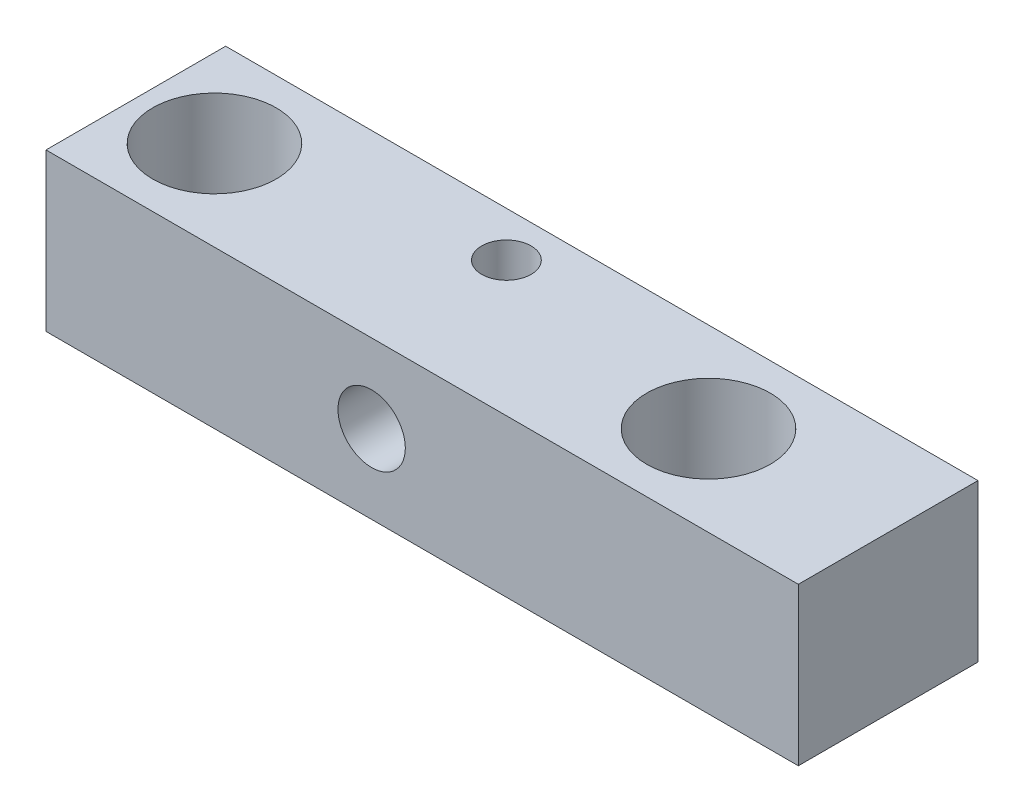
ISO-10303-21;
HEADER;
FILE_DESCRIPTION(('STEP AP214'),'2;1');
FILE_NAME('part.step','',(''),(''),'','','');
FILE_SCHEMA(('AUTOMOTIVE_DESIGN { 1 0 10303 214 1 1 1 1 }'));
ENDSEC;
DATA;
#1=APPLICATION_CONTEXT('core data for automotive mechanical design processes');
#2=APPLICATION_PROTOCOL_DEFINITION('international standard','automotive_design',2000,#1);
#3=PRODUCT_CONTEXT('',#1,'mechanical');
#4=PRODUCT('Part','Part','',(#3));
#5=PRODUCT_RELATED_PRODUCT_CATEGORY('part','',(#4));
#6=PRODUCT_DEFINITION_FORMATION('','',#4);
#7=PRODUCT_DEFINITION_CONTEXT('part definition',#1,'design');
#8=PRODUCT_DEFINITION('design','',#6,#7);
#9=PRODUCT_DEFINITION_SHAPE('','',#8);
#10=(LENGTH_UNIT() NAMED_UNIT(*) SI_UNIT(.MILLI.,.METRE.));
#11=(NAMED_UNIT(*) PLANE_ANGLE_UNIT() SI_UNIT($,.RADIAN.));
#12=(NAMED_UNIT(*) SI_UNIT($,.STERADIAN.) SOLID_ANGLE_UNIT());
#13=UNCERTAINTY_MEASURE_WITH_UNIT(LENGTH_MEASURE(1.E-05),#10,'distance_accuracy_value','');
#14=(GEOMETRIC_REPRESENTATION_CONTEXT(3) GLOBAL_UNCERTAINTY_ASSIGNED_CONTEXT((#13)) GLOBAL_UNIT_ASSIGNED_CONTEXT((#10,
#11,#12)) REPRESENTATION_CONTEXT('',''));
#15=CARTESIAN_POINT('',(0.,0.,0.));
#16=DIRECTION('',(0.,0.,1.));
#17=DIRECTION('',(1.,0.,0.));
#18=AXIS2_PLACEMENT_3D('',#15,#16,#17);
#19=CARTESIAN_POINT('',(5.40284360189574,7.,-6.23933649289099));
#20=DIRECTION('',(0.,-1.,0.));
#21=DIRECTION('',(0.,0.,-1.));
#22=AXIS2_PLACEMENT_3D('',#19,#20,#21);
#23=CYLINDRICAL_SURFACE('',#22,1.1);
#24=CARTESIAN_POINT('',(5.40284360189574,7.,-6.23933649289099));
#25=DIRECTION('',(0.,1.,0.));
#26=DIRECTION('',(0.,0.,1.));
#27=AXIS2_PLACEMENT_3D('',#24,#25,#26);
#28=CIRCLE('',#27,1.1);
#29=CARTESIAN_POINT('',(5.40284360189574,7.,-5.13933649289099));
#30=VERTEX_POINT('',#29);
#31=EDGE_CURVE('E156',#30,#30,#28,.T.);
#32=ORIENTED_EDGE('',*,*,#31,.T.);
#33=EDGE_LOOP('',(#32));
#34=FACE_BOUND('',#33,.T.);
#35=CARTESIAN_POINT('',(5.40284360189574,0.,-6.23933649289099));
#36=DIRECTION('',(0.,1.,0.));
#37=DIRECTION('',(0.,0.,1.));
#38=AXIS2_PLACEMENT_3D('',#35,#36,#37);
#39=CIRCLE('',#38,1.1);
#40=CARTESIAN_POINT('',(5.40284360189574,0.,-5.13933649289099));
#41=VERTEX_POINT('',#40);
#42=EDGE_CURVE('E159',#41,#41,#39,.T.);
#43=ORIENTED_EDGE('',*,*,#42,.F.);
#44=EDGE_LOOP('',(#43));
#45=FACE_BOUND('',#44,.T.);
#46=CARTESIAN_POINT('',(4.30284360189574,4.51980390271856,-6.23933649289099));
#47=CARTESIAN_POINT('',(4.30283809735259,4.5197884223303,-6.21316856956749));
#48=CARTESIAN_POINT('',(4.30377782484599,4.52081207124238,-6.18702303009781));
#49=CARTESIAN_POINT('',(4.30748931555892,4.52479800111967,-6.13505941542424));
#50=CARTESIAN_POINT('',(4.3102576054167,4.52775660652193,-6.10924081377893));
#51=CARTESIAN_POINT('',(4.32112883332008,4.53923247610127,-6.03321089474059));
#52=CARTESIAN_POINT('',(4.33180150244313,4.55035709449521,-5.98373727546318));
#53=CARTESIAN_POINT('',(4.3591400995259,4.57751770428368,-5.88842851211875));
#54=CARTESIAN_POINT('',(4.37576399731924,4.59351913853104,-5.84257053691945));
#55=CARTESIAN_POINT('',(4.41439582734661,4.62856308385542,-5.75425812845338));
#56=CARTESIAN_POINT('',(4.4364226815754,4.64761619920093,-5.71181636855708));
#57=CARTESIAN_POINT('',(4.49019641565153,4.6910030847283,-5.62265827431824));
#58=CARTESIAN_POINT('',(4.52300173276228,4.7156409215698,-5.57672888670937));
#59=CARTESIAN_POINT('',(4.59526376507523,4.76480419804651,-5.49034642774148));
#60=CARTESIAN_POINT('',(4.63472418844916,4.78932956714665,-5.44989643223869));
#61=CARTESIAN_POINT('',(4.72824209288039,4.84100178731811,-5.36785080272779));
#62=CARTESIAN_POINT('',(4.78364788634491,4.86775229130149,-5.327516968547));
#63=CARTESIAN_POINT('',(4.90279476349158,4.91564342800206,-5.25714130230387));
#64=CARTESIAN_POINT('',(4.96651818716249,4.93679566672785,-5.22707813940476));
#65=CARTESIAN_POINT('',(5.08098224458686,4.9658839728927,-5.18626786245236));
#66=CARTESIAN_POINT('',(5.130113554023,4.97587441789688,-5.17244622932842));
#67=CARTESIAN_POINT('',(5.23053681769804,4.99093232203229,-5.15171005200273));
#68=CARTESIAN_POINT('',(5.28182686417869,4.99600403652587,-5.14478953726044));
#69=CARTESIAN_POINT('',(5.38524720386177,5.00079198832914,-5.13825451482477));
#70=CARTESIAN_POINT('',(5.43737920242274,5.00049548606265,-5.13865738662515));
#71=CARTESIAN_POINT('',(5.54076123178974,4.99454372638376,-5.14678513158139));
#72=CARTESIAN_POINT('',(5.59201103744999,4.98888712106594,-5.15451184646464));
#73=CARTESIAN_POINT('',(5.69064156686115,4.97295456066322,-5.17648652723492));
#74=CARTESIAN_POINT('',(5.73809250008411,4.96282394908727,-5.19052954630851));
#75=CARTESIAN_POINT('',(5.82982347806251,4.93872861751305,-5.22440719259422));
#76=CARTESIAN_POINT('',(5.87410284623278,4.92476308246969,-5.24424305102879));
#77=CARTESIAN_POINT('',(5.96353842120922,4.89216706769043,-5.29146856015379));
#78=CARTESIAN_POINT('',(6.0082548079982,4.87319233870793,-5.31944929100812));
#79=CARTESIAN_POINT('',(6.09257955832138,4.83283682505479,-5.38085538797724));
#80=CARTESIAN_POINT('',(6.13218335865204,4.81145392241955,-5.41428555856268));
#81=CARTESIAN_POINT('',(6.21309335628508,4.76337237589801,-5.49283972951178));
#82=CARTESIAN_POINT('',(6.25327718094774,4.73643907867924,-5.5389774640203));
#83=CARTESIAN_POINT('',(6.32570340731536,4.68336061709581,-5.63760851415351));
#84=CARTESIAN_POINT('',(6.35794065407717,4.65721597392981,-5.69010592254221));
#85=CARTESIAN_POINT('',(6.40781667071336,4.6139477123103,-5.7894177560883));
#86=CARTESIAN_POINT('',(6.42710127666119,4.5960863068379,-5.8350805435138));
#87=CARTESIAN_POINT('',(6.45957834340442,4.56480947024316,-5.92982029013945));
#88=CARTESIAN_POINT('',(6.47279824586455,4.55137409164936,-5.97888069076255));
#89=CARTESIAN_POINT('',(6.48921958421055,4.53435203403151,-6.06330748652717));
#90=CARTESIAN_POINT('',(6.49427985583401,4.52898427735783,-6.09795274438175));
#91=CARTESIAN_POINT('',(6.50111397735627,4.52167041089261,-6.16815235281215));
#92=CARTESIAN_POINT('',(6.50286538638044,4.51974766987578,-6.20371126478535));
#93=CARTESIAN_POINT('',(6.50284360189574,4.51980390271856,-6.23933649289099));
#94=B_SPLINE_CURVE_WITH_KNOTS('',3,(#46,#47,#48,#49,#50,#51,#52,#53,#54,#55,#56,#57,#58,#59,#60,
#61,#62,#63,#64,#65,#66,#67,#68,#69,#70,#71,#72,#73,#74,#75,#76,#77,#78,#79,#80,#81,#82,#83,#84,
#85,#86,#87,#88,#89,#90,#91,#92,#93),.UNSPECIFIED.,.F.,.F.,(4,2,2,2,2,2,2,2,2,2,2,2,2,2,2,2,2,2,
2,2,2,2,2,4),(0.,0.0784271539245262,0.156705761903694,0.311235939811898,0.464695617922897,
0.618700607549997,0.802819713980823,0.98704175109855,1.20651401122566,1.42552764512265,
1.58088877497421,1.73611537637143,1.89171040174665,2.04734456499831,2.19825724424889,
2.34920202217558,2.5167590995247,2.6844647097342,2.8842363485675,3.08413724018056,
3.24169550381706,3.39853363780779,3.50448843352519,3.61115927589421),.UNSPECIFIED.);
#95=CARTESIAN_POINT('',(4.30284360189574,4.51980390271856,-6.23933649289099));
#96=VERTEX_POINT('',#95);
#97=CARTESIAN_POINT('',(6.50284360189574,4.51980390271856,-6.23933649289099));
#98=VERTEX_POINT('',#97);
#99=EDGE_CURVE('E55',#96,#98,#94,.T.);
#100=ORIENTED_EDGE('',*,*,#99,.F.);
#101=DIRECTION('',(0.,-1.,0.));
#102=VECTOR('',#101,1.);
#103=CARTESIAN_POINT('',(4.30284360189574,7.,-6.23933649289099));
#104=LINE('',#103,#102);
#105=CARTESIAN_POINT('',(4.30284360189574,2.48019609728144,-6.23933649289099));
#106=VERTEX_POINT('',#105);
#107=EDGE_CURVE('E13',#96,#106,#104,.T.);
#108=ORIENTED_EDGE('',*,*,#107,.T.);
#109=CARTESIAN_POINT('',(6.50284360189574,2.48019609728144,-6.23933649289099));
#110=CARTESIAN_POINT('',(6.5028491064389,2.4802115776697,-6.21316856956749));
#111=CARTESIAN_POINT('',(6.50190937894549,2.47918792875762,-6.18702303009781));
#112=CARTESIAN_POINT('',(6.49819788823257,2.47520199888033,-6.13505941542424));
#113=CARTESIAN_POINT('',(6.49542959837479,2.47224339347807,-6.10924081377893));
#114=CARTESIAN_POINT('',(6.48455837047141,2.46076752389873,-6.03321089474059));
#115=CARTESIAN_POINT('',(6.47388570134835,2.44964290550479,-5.98373727546318));
#116=CARTESIAN_POINT('',(6.44654710426558,2.42248229571632,-5.88842851211875));
#117=CARTESIAN_POINT('',(6.42992320647224,2.40648086146896,-5.84257053691945));
#118=CARTESIAN_POINT('',(6.39129137644488,2.37143691614458,-5.75425812845338));
#119=CARTESIAN_POINT('',(6.36926452221609,2.35238380079907,-5.71181636855708));
#120=CARTESIAN_POINT('',(6.31549078813995,2.3089969152717,-5.62265827431824));
#121=CARTESIAN_POINT('',(6.2826854710292,2.2843590784302,-5.57672888670937));
#122=CARTESIAN_POINT('',(6.21042343871625,2.23519580195349,-5.49034642774148));
#123=CARTESIAN_POINT('',(6.17096301534232,2.21067043285335,-5.44989643223869));
#124=CARTESIAN_POINT('',(6.0774451109111,2.15899821268189,-5.36785080272779));
#125=CARTESIAN_POINT('',(6.02203931744658,2.13224770869851,-5.327516968547));
#126=CARTESIAN_POINT('',(5.90289244029991,2.08435657199794,-5.25714130230387));
#127=CARTESIAN_POINT('',(5.839169016629,2.06320433327215,-5.22707813940476));
#128=CARTESIAN_POINT('',(5.72470495920463,2.0341160271073,-5.18626786245236));
#129=CARTESIAN_POINT('',(5.67557364976849,2.02412558210312,-5.17244622932842));
#130=CARTESIAN_POINT('',(5.57515038609345,2.00906767796771,-5.15171005200273));
#131=CARTESIAN_POINT('',(5.5238603396128,2.00399596347413,-5.14478953726044));
#132=CARTESIAN_POINT('',(5.42043999992972,1.99920801167086,-5.13825451482477));
#133=CARTESIAN_POINT('',(5.36830800136875,1.99950451393735,-5.13865738662515));
#134=CARTESIAN_POINT('',(5.26492597200174,2.00545627361624,-5.14678513158139));
#135=CARTESIAN_POINT('',(5.21367616634149,2.01111287893406,-5.15451184646464));
#136=CARTESIAN_POINT('',(5.11504563693033,2.02704543933678,-5.17648652723492));
#137=CARTESIAN_POINT('',(5.06759470370738,2.03717605091273,-5.19052954630851));
#138=CARTESIAN_POINT('',(4.97586372572898,2.06127138248694,-5.22440719259422));
#139=CARTESIAN_POINT('',(4.93158435755871,2.07523691753031,-5.24424305102879));
#140=CARTESIAN_POINT('',(4.84214878258226,2.10783293230957,-5.29146856015378));
#141=CARTESIAN_POINT('',(4.79743239579329,2.12680766129207,-5.31944929100812));
#142=CARTESIAN_POINT('',(4.7131076454701,2.16716317494521,-5.38085538797723));
#143=CARTESIAN_POINT('',(4.67350384513945,2.18854607758045,-5.41428555856268));
#144=CARTESIAN_POINT('',(4.59259384750641,2.23662762410199,-5.49283972951178));
#145=CARTESIAN_POINT('',(4.55241002284374,2.26356092132076,-5.5389774640203));
#146=CARTESIAN_POINT('',(4.47998379647612,2.31663938290419,-5.63760851415351));
#147=CARTESIAN_POINT('',(4.44774654971432,2.34278402607019,-5.6901059225422));
#148=CARTESIAN_POINT('',(4.39787053307812,2.3860522876897,-5.78941775608829));
#149=CARTESIAN_POINT('',(4.3785859271303,2.4039136931621,-5.8350805435138));
#150=CARTESIAN_POINT('',(4.34610886038707,2.43519052975684,-5.92982029013945));
#151=CARTESIAN_POINT('',(4.33288895792693,2.44862590835064,-5.97888069076255));
#152=CARTESIAN_POINT('',(4.31646761958094,2.46564796596849,-6.06330748652717));
#153=CARTESIAN_POINT('',(4.31140734795747,2.47101572264217,-6.09795274438175));
#154=CARTESIAN_POINT('',(4.30457322643522,2.47832958910739,-6.16815235281215));
#155=CARTESIAN_POINT('',(4.30282181741105,2.48025233012422,-6.20371126478535));
#156=CARTESIAN_POINT('',(4.30284360189574,2.48019609728144,-6.23933649289099));
#157=B_SPLINE_CURVE_WITH_KNOTS('',3,(#109,#110,#111,#112,#113,#114,#115,#116,#117,#118,#119,
#120,#121,#122,#123,#124,#125,#126,#127,#128,#129,#130,#131,#132,#133,#134,#135,#136,#137,#138,
#139,#140,#141,#142,#143,#144,#145,#146,#147,#148,#149,#150,#151,#152,#153,#154,#155,#156),
.UNSPECIFIED.,.F.,.F.,(4,2,2,2,2,2,2,2,2,2,2,2,2,2,2,2,2,2,2,2,2,2,2,4),(0.,0.0784271539245262,
0.156705761903694,0.311235939811898,0.464695617922897,0.618700607549998,0.802819713980823,
0.987041751098551,1.20651401122566,1.42552764512265,1.58088877497421,1.73611537637142,
1.89171040174665,2.04734456499831,2.19825724424889,2.34920202217558,2.5167590995247,
2.6844647097342,2.8842363485675,3.08413724018056,3.24169550381705,3.39853363780778,
3.50448843352519,3.61115927589421),.UNSPECIFIED.);
#158=CARTESIAN_POINT('',(6.50284360189574,2.48019609728144,-6.23933649289099));
#159=VERTEX_POINT('',#158);
#160=EDGE_CURVE('E109',#159,#106,#157,.T.);
#161=ORIENTED_EDGE('',*,*,#160,.F.);
#162=DIRECTION('',(0.,-1.,0.));
#163=VECTOR('',#162,1.);
#164=CARTESIAN_POINT('',(6.50284360189574,7.,-6.23933649289099));
#165=LINE('',#164,#163);
#166=EDGE_CURVE('E112',#159,#98,#165,.F.);
#167=ORIENTED_EDGE('',*,*,#166,.T.);
#168=EDGE_LOOP('',(#100,#108,#161,#167));
#169=FACE_BOUND('',#168,.T.);
#170=ADVANCED_FACE('F47',(#34,#45,#169),#23,.F.);
#171=CARTESIAN_POINT('',(0.,7.,0.));
#172=DIRECTION('',(0.,1.,0.));
#173=DIRECTION('',(0.,0.,1.));
#174=AXIS2_PLACEMENT_3D('',#171,#172,#173);
#175=PLANE('',#174);
#176=DIRECTION('',(0.,0.,1.));
#177=VECTOR('',#176,1.);
#178=CARTESIAN_POINT('',(-9.09715639810427,7.,-8.23933649289099));
#179=LINE('',#178,#177);
#180=CARTESIAN_POINT('',(-9.09715639810427,7.,-8.23933649289099));
#181=VERTEX_POINT('',#180);
#182=CARTESIAN_POINT('',(-9.09715639810427,7.,-0.239336492890993));
#183=VERTEX_POINT('',#182);
#184=EDGE_CURVE('E69',#181,#183,#179,.T.);
#185=ORIENTED_EDGE('',*,*,#184,.T.);
#186=DIRECTION('',(1.,0.,0.));
#187=VECTOR('',#186,1.);
#188=CARTESIAN_POINT('',(-13.5971563981043,7.,-0.239336492890993));
#189=LINE('',#188,#187);
#190=CARTESIAN_POINT('',(24.4028436018957,7.,-0.239336492890993));
#191=VERTEX_POINT('',#190);
#192=EDGE_CURVE('E180',#183,#191,#189,.T.);
#193=ORIENTED_EDGE('',*,*,#192,.T.);
#194=DIRECTION('',(0.,0.,-1.));
#195=VECTOR('',#194,1.);
#196=CARTESIAN_POINT('',(24.4028436018957,7.,-8.23933649289099));
#197=LINE('',#196,#195);
#198=CARTESIAN_POINT('',(24.4028436018957,7.,-8.23933649289099));
#199=VERTEX_POINT('',#198);
#200=EDGE_CURVE('E182',#191,#199,#197,.T.);
#201=ORIENTED_EDGE('',*,*,#200,.T.);
#202=DIRECTION('',(-1.,0.,0.));
#203=VECTOR('',#202,1.);
#204=CARTESIAN_POINT('',(-13.5971563981043,7.,-8.23933649289099));
#205=LINE('',#204,#203);
#206=EDGE_CURVE('E185',#199,#181,#205,.T.);
#207=ORIENTED_EDGE('',*,*,#206,.T.);
#208=EDGE_LOOP('',(#185,#193,#201,#207));
#209=FACE_BOUND('',#208,.T.);
#210=CARTESIAN_POINT('',(16.4028436018957,7.,-4.23933649289099));
#211=DIRECTION('',(0.,1.,0.));
#212=DIRECTION('',(0.,0.,1.));
#213=AXIS2_PLACEMENT_3D('',#210,#211,#212);
#214=CIRCLE('',#213,2.75);
#215=CARTESIAN_POINT('',(16.4028436018957,7.,-1.489336492891));
#216=VERTEX_POINT('',#215);
#217=EDGE_CURVE('E168',#216,#216,#214,.T.);
#218=ORIENTED_EDGE('',*,*,#217,.F.);
#219=EDGE_LOOP('',(#218));
#220=FACE_BOUND('',#219,.T.);
#221=CARTESIAN_POINT('',(-5.59715639810427,7.,-4.23933649289099));
#222=DIRECTION('',(0.,1.,0.));
#223=DIRECTION('',(0.,0.,1.));
#224=AXIS2_PLACEMENT_3D('',#221,#222,#223);
#225=CIRCLE('',#224,2.75);
#226=CARTESIAN_POINT('',(-5.59715639810427,7.,-1.48933649289099));
#227=VERTEX_POINT('',#226);
#228=EDGE_CURVE('E174',#227,#227,#225,.T.);
#229=ORIENTED_EDGE('',*,*,#228,.F.);
#230=EDGE_LOOP('',(#229));
#231=FACE_BOUND('',#230,.T.);
#232=ORIENTED_EDGE('',*,*,#31,.F.);
#233=EDGE_LOOP('',(#232));
#234=FACE_BOUND('',#233,.T.);
#235=ADVANCED_FACE('F144',(#209,#220,#231,#234),#175,.T.);
#236=CARTESIAN_POINT('',(0.,0.,0.));
#237=DIRECTION('',(0.,1.,0.));
#238=DIRECTION('',(0.,0.,1.));
#239=AXIS2_PLACEMENT_3D('',#236,#237,#238);
#240=PLANE('',#239);
#241=DIRECTION('',(1.,0.,0.));
#242=VECTOR('',#241,1.);
#243=CARTESIAN_POINT('',(-13.5971563981043,0.,-0.239336492890993));
#244=LINE('',#243,#242);
#245=CARTESIAN_POINT('',(-9.09715639810427,0.,-0.239336492890993));
#246=VERTEX_POINT('',#245);
#247=CARTESIAN_POINT('',(24.4028436018957,0.,-0.239336492890993));
#248=VERTEX_POINT('',#247);
#249=EDGE_CURVE('E177',#246,#248,#244,.T.);
#250=ORIENTED_EDGE('',*,*,#249,.F.);
#251=DIRECTION('',(0.,0.,1.));
#252=VECTOR('',#251,1.);
#253=CARTESIAN_POINT('',(-9.09715639810427,0.,-8.23933649289099));
#254=LINE('',#253,#252);
#255=CARTESIAN_POINT('',(-9.09715639810427,0.,-8.23933649289099));
#256=VERTEX_POINT('',#255);
#257=EDGE_CURVE('E164',#256,#246,#254,.T.);
#258=ORIENTED_EDGE('',*,*,#257,.F.);
#259=DIRECTION('',(-1.,0.,0.));
#260=VECTOR('',#259,1.);
#261=CARTESIAN_POINT('',(-13.5971563981043,0.,-8.23933649289099));
#262=LINE('',#261,#260);
#263=CARTESIAN_POINT('',(24.4028436018957,0.,-8.23933649289099));
#264=VERTEX_POINT('',#263);
#265=EDGE_CURVE('E183',#264,#256,#262,.T.);
#266=ORIENTED_EDGE('',*,*,#265,.F.);
#267=DIRECTION('',(0.,0.,-1.));
#268=VECTOR('',#267,1.);
#269=CARTESIAN_POINT('',(24.4028436018957,0.,-8.23933649289099));
#270=LINE('',#269,#268);
#271=EDGE_CURVE('E190',#248,#264,#270,.T.);
#272=ORIENTED_EDGE('',*,*,#271,.F.);
#273=EDGE_LOOP('',(#250,#258,#266,#272));
#274=FACE_BOUND('',#273,.T.);
#275=CARTESIAN_POINT('',(-5.59715639810427,0.,-4.23933649289099));
#276=DIRECTION('',(0.,1.,0.));
#277=DIRECTION('',(0.,0.,1.));
#278=AXIS2_PLACEMENT_3D('',#275,#276,#277);
#279=CIRCLE('',#278,2.75);
#280=CARTESIAN_POINT('',(-5.59715639810427,0.,-1.48933649289099));
#281=VERTEX_POINT('',#280);
#282=EDGE_CURVE('E171',#281,#281,#279,.T.);
#283=ORIENTED_EDGE('',*,*,#282,.T.);
#284=EDGE_LOOP('',(#283));
#285=FACE_BOUND('',#284,.T.);
#286=CARTESIAN_POINT('',(16.4028436018957,0.,-4.23933649289099));
#287=DIRECTION('',(0.,1.,0.));
#288=DIRECTION('',(0.,0.,1.));
#289=AXIS2_PLACEMENT_3D('',#286,#287,#288);
#290=CIRCLE('',#289,2.75);
#291=CARTESIAN_POINT('',(16.4028436018957,0.,-1.489336492891));
#292=VERTEX_POINT('',#291);
#293=EDGE_CURVE('E162',#292,#292,#290,.T.);
#294=ORIENTED_EDGE('',*,*,#293,.T.);
#295=EDGE_LOOP('',(#294));
#296=FACE_BOUND('',#295,.T.);
#297=ORIENTED_EDGE('',*,*,#42,.T.);
#298=EDGE_LOOP('',(#297));
#299=FACE_BOUND('',#298,.T.);
#300=ADVANCED_FACE('F150',(#274,#285,#296,#299),#240,.F.);
#301=CARTESIAN_POINT('',(-13.5971563981043,7.,-0.239336492890993));
#302=DIRECTION('',(0.,0.,-1.));
#303=DIRECTION('',(-1.,0.,0.));
#304=AXIS2_PLACEMENT_3D('',#301,#302,#303);
#305=PLANE('',#304);
#306=CARTESIAN_POINT('',(5.40284360189574,3.5,-0.239336492890993));
#307=DIRECTION('',(0.,0.,1.));
#308=DIRECTION('',(1.,0.,0.));
#309=AXIS2_PLACEMENT_3D('',#306,#307,#308);
#310=CIRCLE('',#309,1.5);
#311=CARTESIAN_POINT('',(6.90284360189574,3.5,-0.239336492890993));
#312=VERTEX_POINT('',#311);
#313=EDGE_CURVE('E220',#312,#312,#310,.T.);
#314=ORIENTED_EDGE('',*,*,#313,.F.);
#315=EDGE_LOOP('',(#314));
#316=FACE_BOUND('',#315,.T.);
#317=ORIENTED_EDGE('',*,*,#192,.F.);
#318=DIRECTION('',(0.,1.,0.));
#319=VECTOR('',#318,1.);
#320=CARTESIAN_POINT('',(-9.09715639810427,7.,-0.239336492890993));
#321=LINE('',#320,#319);
#322=EDGE_CURVE('E110',#246,#183,#321,.T.);
#323=ORIENTED_EDGE('',*,*,#322,.F.);
#324=ORIENTED_EDGE('',*,*,#249,.T.);
#325=DIRECTION('',(0.,-1.,0.));
#326=VECTOR('',#325,1.);
#327=CARTESIAN_POINT('',(24.4028436018957,7.,-0.239336492890993));
#328=LINE('',#327,#326);
#329=EDGE_CURVE('E196',#191,#248,#328,.T.);
#330=ORIENTED_EDGE('',*,*,#329,.F.);
#331=EDGE_LOOP('',(#317,#323,#324,#330));
#332=FACE_BOUND('',#331,.T.);
#333=ADVANCED_FACE('F49',(#316,#332),#305,.F.);
#334=CARTESIAN_POINT('',(24.4028436018957,7.,-8.23933649289099));
#335=DIRECTION('',(-1.,0.,0.));
#336=DIRECTION('',(0.,0.,1.));
#337=AXIS2_PLACEMENT_3D('',#334,#335,#336);
#338=PLANE('',#337);
#339=ORIENTED_EDGE('',*,*,#271,.T.);
#340=DIRECTION('',(0.,-1.,0.));
#341=VECTOR('',#340,1.);
#342=CARTESIAN_POINT('',(24.4028436018957,7.,-8.23933649289099));
#343=LINE('',#342,#341);
#344=EDGE_CURVE('E188',#199,#264,#343,.T.);
#345=ORIENTED_EDGE('',*,*,#344,.F.);
#346=ORIENTED_EDGE('',*,*,#200,.F.);
#347=ORIENTED_EDGE('',*,*,#329,.T.);
#348=EDGE_LOOP('',(#339,#345,#346,#347));
#349=FACE_BOUND('',#348,.T.);
#350=ADVANCED_FACE('F202',(#349),#338,.F.);
#351=CARTESIAN_POINT('',(-13.5971563981043,7.,-8.23933649289099));
#352=DIRECTION('',(0.,0.,1.));
#353=DIRECTION('',(1.,0.,0.));
#354=AXIS2_PLACEMENT_3D('',#351,#352,#353);
#355=PLANE('',#354);
#356=ORIENTED_EDGE('',*,*,#265,.T.);
#357=DIRECTION('',(0.,1.,0.));
#358=VECTOR('',#357,1.);
#359=CARTESIAN_POINT('',(-9.09715639810427,7.,-8.23933649289099));
#360=LINE('',#359,#358);
#361=EDGE_CURVE('E214',#256,#181,#360,.T.);
#362=ORIENTED_EDGE('',*,*,#361,.T.);
#363=ORIENTED_EDGE('',*,*,#206,.F.);
#364=ORIENTED_EDGE('',*,*,#344,.T.);
#365=EDGE_LOOP('',(#356,#362,#363,#364));
#366=FACE_BOUND('',#365,.T.);
#367=ADVANCED_FACE('F212',(#366),#355,.F.);
#368=CARTESIAN_POINT('',(-5.59715639810427,7.,-4.23933649289099));
#369=DIRECTION('',(0.,-1.,0.));
#370=DIRECTION('',(0.,0.,-1.));
#371=AXIS2_PLACEMENT_3D('',#368,#369,#370);
#372=CYLINDRICAL_SURFACE('',#371,2.75);
#373=ORIENTED_EDGE('',*,*,#228,.T.);
#374=EDGE_LOOP('',(#373));
#375=FACE_BOUND('',#374,.T.);
#376=ORIENTED_EDGE('',*,*,#282,.F.);
#377=EDGE_LOOP('',(#376));
#378=FACE_BOUND('',#377,.T.);
#379=ADVANCED_FACE('F141',(#375,#378),#372,.F.);
#380=CARTESIAN_POINT('',(16.4028436018957,7.,-4.23933649289099));
#381=DIRECTION('',(0.,-1.,0.));
#382=DIRECTION('',(0.,0.,-1.));
#383=AXIS2_PLACEMENT_3D('',#380,#381,#382);
#384=CYLINDRICAL_SURFACE('',#383,2.75);
#385=ORIENTED_EDGE('',*,*,#217,.T.);
#386=EDGE_LOOP('',(#385));
#387=FACE_BOUND('',#386,.T.);
#388=ORIENTED_EDGE('',*,*,#293,.F.);
#389=EDGE_LOOP('',(#388));
#390=FACE_BOUND('',#389,.T.);
#391=ADVANCED_FACE('F135',(#387,#390),#384,.F.);
#392=CARTESIAN_POINT('',(-9.09715639810427,7.,-8.23933649289099));
#393=DIRECTION('',(1.,0.,0.));
#394=DIRECTION('',(0.,0.,-1.));
#395=AXIS2_PLACEMENT_3D('',#392,#393,#394);
#396=PLANE('',#395);
#397=ORIENTED_EDGE('',*,*,#322,.T.);
#398=ORIENTED_EDGE('',*,*,#184,.F.);
#399=ORIENTED_EDGE('',*,*,#361,.F.);
#400=ORIENTED_EDGE('',*,*,#257,.T.);
#401=EDGE_LOOP('',(#397,#398,#399,#400));
#402=FACE_BOUND('',#401,.T.);
#403=ADVANCED_FACE('F132',(#402),#396,.F.);
#404=CARTESIAN_POINT('',(5.40284360189574,3.5,-6.23933649289099));
#405=DIRECTION('',(0.,0.,1.));
#406=DIRECTION('',(1.,0.,0.));
#407=AXIS2_PLACEMENT_3D('',#404,#405,#406);
#408=PLANE('',#407);
#409=CARTESIAN_POINT('',(5.40284360189574,3.5,-6.23933649289099));
#410=DIRECTION('',(0.,0.,1.));
#411=DIRECTION('',(1.,0.,0.));
#412=AXIS2_PLACEMENT_3D('',#409,#410,#411);
#413=CIRCLE('',#412,1.5);
#414=EDGE_CURVE('E101',#96,#106,#413,.T.);
#415=ORIENTED_EDGE('',*,*,#414,.T.);
#416=ORIENTED_EDGE('',*,*,#107,.F.);
#417=EDGE_LOOP('',(#415,#416));
#418=FACE_BOUND('',#417,.T.);
#419=ADVANCED_FACE('F100',(#418),#408,.T.);
#420=CARTESIAN_POINT('',(5.40284360189574,3.5,-6.23933649289099));
#421=DIRECTION('',(0.,0.,1.));
#422=DIRECTION('',(1.,0.,0.));
#423=AXIS2_PLACEMENT_3D('',#420,#421,#422);
#424=CYLINDRICAL_SURFACE('',#423,1.5);
#425=ORIENTED_EDGE('',*,*,#99,.T.);
#426=EDGE_CURVE('E61',#159,#98,#413,.T.);
#427=ORIENTED_EDGE('',*,*,#426,.F.);
#428=ORIENTED_EDGE('',*,*,#160,.T.);
#429=ORIENTED_EDGE('',*,*,#414,.F.);
#430=EDGE_LOOP('',(#425,#427,#428,#429));
#431=FACE_BOUND('',#430,.T.);
#432=ORIENTED_EDGE('',*,*,#313,.T.);
#433=EDGE_LOOP('',(#432));
#434=FACE_BOUND('',#433,.T.);
#435=ADVANCED_FACE('F106',(#431,#434),#424,.F.);
#436=ORIENTED_EDGE('',*,*,#426,.T.);
#437=ORIENTED_EDGE('',*,*,#166,.F.);
#438=EDGE_LOOP('',(#436,#437));
#439=FACE_BOUND('',#438,.T.);
#440=ADVANCED_FACE('F131',(#439),#408,.T.);
#441=CLOSED_SHELL('',(#170,#235,#300,#333,#350,#367,#379,#391,#403,#419,#435,#440));
#442=MANIFOLD_SOLID_BREP('B2',#441);
#443=ADVANCED_BREP_SHAPE_REPRESENTATION('',(#18,#442),#14);
#444=SHAPE_DEFINITION_REPRESENTATION(#9,#443);
ENDSEC;
END-ISO-10303-21;
